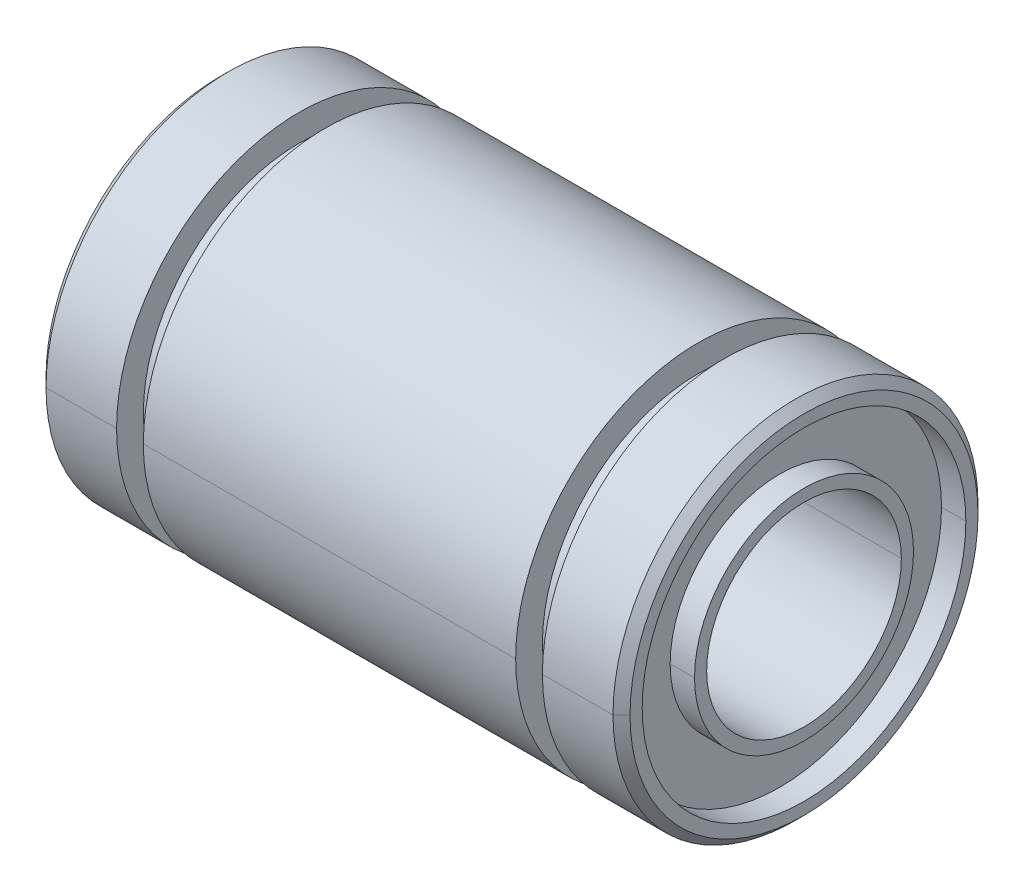
ISO-10303-21;
HEADER;
FILE_DESCRIPTION(('STEP AP214'),'2;1');
FILE_NAME('part.step','',(''),(''),'','','');
FILE_SCHEMA(('AUTOMOTIVE_DESIGN { 1 0 10303 214 1 1 1 1 }'));
ENDSEC;
DATA;
#1=APPLICATION_CONTEXT('core data for automotive mechanical design processes');
#2=APPLICATION_PROTOCOL_DEFINITION('international standard','automotive_design',2000,#1);
#3=PRODUCT_CONTEXT('',#1,'mechanical');
#4=PRODUCT('Part','Part','',(#3));
#5=PRODUCT_RELATED_PRODUCT_CATEGORY('part','',(#4));
#6=PRODUCT_DEFINITION_FORMATION('','',#4);
#7=PRODUCT_DEFINITION_CONTEXT('part definition',#1,'design');
#8=PRODUCT_DEFINITION('design','',#6,#7);
#9=PRODUCT_DEFINITION_SHAPE('','',#8);
#10=(LENGTH_UNIT() NAMED_UNIT(*) SI_UNIT(.MILLI.,.METRE.));
#11=(NAMED_UNIT(*) PLANE_ANGLE_UNIT() SI_UNIT($,.RADIAN.));
#12=(NAMED_UNIT(*) SI_UNIT($,.STERADIAN.) SOLID_ANGLE_UNIT());
#13=UNCERTAINTY_MEASURE_WITH_UNIT(LENGTH_MEASURE(1.E-05),#10,'distance_accuracy_value','');
#14=(GEOMETRIC_REPRESENTATION_CONTEXT(3) GLOBAL_UNCERTAINTY_ASSIGNED_CONTEXT((#13)) GLOBAL_UNIT_ASSIGNED_CONTEXT((#10,
#11,#12)) REPRESENTATION_CONTEXT('',''));
#15=CARTESIAN_POINT('',(0.,0.,0.));
#16=DIRECTION('',(0.,0.,1.));
#17=DIRECTION('',(1.,0.,0.));
#18=AXIS2_PLACEMENT_3D('',#15,#16,#17);
#19=CARTESIAN_POINT('',(12.,0.,0.));
#20=DIRECTION('',(1.,0.,0.));
#21=DIRECTION('',(0.,1.,0.));
#22=AXIS2_PLACEMENT_3D('',#19,#20,#21);
#23=PLANE('',#22);
#24=CARTESIAN_POINT('',(12.,0.,0.));
#25=DIRECTION('',(-1.,0.,0.));
#26=DIRECTION('',(0.,0.,1.));
#27=AXIS2_PLACEMENT_3D('',#24,#25,#26);
#28=CIRCLE('',#27,6.65);
#29=CARTESIAN_POINT('',(12.,0.,6.65));
#30=VERTEX_POINT('',#29);
#31=CARTESIAN_POINT('',(12.,0.,-6.65));
#32=VERTEX_POINT('',#31);
#33=EDGE_CURVE('E10',#30,#32,#28,.T.);
#34=ORIENTED_EDGE('',*,*,#33,.T.);
#35=CARTESIAN_POINT('',(12.,0.,0.));
#36=DIRECTION('',(-1.,0.,0.));
#37=DIRECTION('',(0.,0.,1.));
#38=AXIS2_PLACEMENT_3D('',#35,#36,#37);
#39=CIRCLE('',#38,6.65);
#40=EDGE_CURVE('E1077',#32,#30,#39,.T.);
#41=ORIENTED_EDGE('',*,*,#40,.T.);
#42=EDGE_LOOP('',(#34,#41));
#43=FACE_BOUND('',#42,.T.);
#44=CARTESIAN_POINT('',(12.,0.,0.));
#45=DIRECTION('',(-1.,0.,0.));
#46=DIRECTION('',(0.,0.,1.));
#47=AXIS2_PLACEMENT_3D('',#44,#45,#46);
#48=CIRCLE('',#47,7.15);
#49=CARTESIAN_POINT('',(12.,0.,7.15));
#50=VERTEX_POINT('',#49);
#51=CARTESIAN_POINT('',(12.,0.,-7.15));
#52=VERTEX_POINT('',#51);
#53=EDGE_CURVE('E385',#50,#52,#48,.T.);
#54=ORIENTED_EDGE('',*,*,#53,.F.);
#55=CARTESIAN_POINT('',(12.,0.,0.));
#56=DIRECTION('',(-1.,0.,0.));
#57=DIRECTION('',(0.,0.,1.));
#58=AXIS2_PLACEMENT_3D('',#55,#56,#57);
#59=CIRCLE('',#58,7.15);
#60=EDGE_CURVE('E36',#52,#50,#59,.T.);
#61=ORIENTED_EDGE('',*,*,#60,.F.);
#62=EDGE_LOOP('',(#54,#61));
#63=FACE_BOUND('',#62,.T.);
#64=ADVANCED_FACE('F16',(#43,#63),#23,.T.);
#65=CARTESIAN_POINT('',(-45.6895053247726,0.,0.));
#66=DIRECTION('',(-1.,0.,0.));
#67=DIRECTION('',(0.,0.,1.));
#68=AXIS2_PLACEMENT_3D('',#65,#66,#67);
#69=CYLINDRICAL_SURFACE('',#68,6.65);
#70=DIRECTION('',(-1.,0.,0.));
#71=VECTOR('',#70,1.);
#72=CARTESIAN_POINT('',(-45.6895053247726,0.,-6.65));
#73=LINE('',#72,#71);
#74=CARTESIAN_POINT('',(11.,0.,-6.65));
#75=VERTEX_POINT('',#74);
#76=EDGE_CURVE('E1072',#32,#75,#73,.T.);
#77=ORIENTED_EDGE('',*,*,#76,.F.);
#78=ORIENTED_EDGE('',*,*,#33,.F.);
#79=DIRECTION('',(-1.,0.,0.));
#80=VECTOR('',#79,1.);
#81=CARTESIAN_POINT('',(-45.6895053247726,0.,6.65));
#82=LINE('',#81,#80);
#83=CARTESIAN_POINT('',(11.,0.,6.65));
#84=VERTEX_POINT('',#83);
#85=EDGE_CURVE('E449',#30,#84,#82,.T.);
#86=ORIENTED_EDGE('',*,*,#85,.T.);
#87=CARTESIAN_POINT('',(11.,0.,0.));
#88=DIRECTION('',(-1.,0.,0.));
#89=DIRECTION('',(0.,0.,1.));
#90=AXIS2_PLACEMENT_3D('',#87,#88,#89);
#91=CIRCLE('',#90,6.65);
#92=EDGE_CURVE('E24',#84,#75,#91,.T.);
#93=ORIENTED_EDGE('',*,*,#92,.T.);
#94=EDGE_LOOP('',(#77,#78,#86,#93));
#95=FACE_BOUND('',#94,.T.);
#96=ADVANCED_FACE('F509',(#95),#69,.F.);
#97=CARTESIAN_POINT('',(11.,0.,0.));
#98=DIRECTION('',(1.,0.,0.));
#99=DIRECTION('',(0.,1.,0.));
#100=AXIS2_PLACEMENT_3D('',#97,#98,#99);
#101=PLANE('',#100);
#102=CARTESIAN_POINT('',(11.,0.,0.));
#103=DIRECTION('',(-1.,0.,0.));
#104=DIRECTION('',(0.,0.,1.));
#105=AXIS2_PLACEMENT_3D('',#102,#103,#104);
#106=CIRCLE('',#105,4.5);
#107=CARTESIAN_POINT('',(11.,0.,4.5));
#108=VERTEX_POINT('',#107);
#109=CARTESIAN_POINT('',(11.,0.,-4.5));
#110=VERTEX_POINT('',#109);
#111=EDGE_CURVE('E456',#108,#110,#106,.T.);
#112=ORIENTED_EDGE('',*,*,#111,.T.);
#113=CARTESIAN_POINT('',(11.,0.,0.));
#114=DIRECTION('',(-1.,0.,0.));
#115=DIRECTION('',(0.,0.,1.));
#116=AXIS2_PLACEMENT_3D('',#113,#114,#115);
#117=CIRCLE('',#116,4.5);
#118=EDGE_CURVE('E424',#110,#108,#117,.T.);
#119=ORIENTED_EDGE('',*,*,#118,.T.);
#120=EDGE_LOOP('',(#112,#119));
#121=FACE_BOUND('',#120,.T.);
#122=ORIENTED_EDGE('',*,*,#92,.F.);
#123=CARTESIAN_POINT('',(11.,0.,0.));
#124=DIRECTION('',(-1.,0.,0.));
#125=DIRECTION('',(0.,0.,1.));
#126=AXIS2_PLACEMENT_3D('',#123,#124,#125);
#127=CIRCLE('',#126,6.65);
#128=EDGE_CURVE('E443',#75,#84,#127,.T.);
#129=ORIENTED_EDGE('',*,*,#128,.F.);
#130=EDGE_LOOP('',(#122,#129));
#131=FACE_BOUND('',#130,.T.);
#132=ADVANCED_FACE('F514',(#121,#131),#101,.T.);
#133=CARTESIAN_POINT('',(-45.6895053247726,0.,0.));
#134=DIRECTION('',(-1.,0.,0.));
#135=DIRECTION('',(0.,0.,1.));
#136=AXIS2_PLACEMENT_3D('',#133,#134,#135);
#137=CYLINDRICAL_SURFACE('',#136,4.5);
#138=DIRECTION('',(-1.,0.,0.));
#139=VECTOR('',#138,1.);
#140=CARTESIAN_POINT('',(-45.6895053247726,0.,-4.5));
#141=LINE('',#140,#139);
#142=CARTESIAN_POINT('',(12.,0.,-4.5));
#143=VERTEX_POINT('',#142);
#144=EDGE_CURVE('E448',#143,#110,#141,.T.);
#145=ORIENTED_EDGE('',*,*,#144,.F.);
#146=CARTESIAN_POINT('',(12.,0.,0.));
#147=DIRECTION('',(-1.,0.,0.));
#148=DIRECTION('',(0.,0.,1.));
#149=AXIS2_PLACEMENT_3D('',#146,#147,#148);
#150=CIRCLE('',#149,4.5);
#151=CARTESIAN_POINT('',(12.,0.,4.5));
#152=VERTEX_POINT('',#151);
#153=EDGE_CURVE('E422',#143,#152,#150,.T.);
#154=ORIENTED_EDGE('',*,*,#153,.T.);
#155=DIRECTION('',(-1.,0.,0.));
#156=VECTOR('',#155,1.);
#157=CARTESIAN_POINT('',(-45.6895053247726,0.,4.5));
#158=LINE('',#157,#156);
#159=EDGE_CURVE('E245',#152,#108,#158,.T.);
#160=ORIENTED_EDGE('',*,*,#159,.T.);
#161=ORIENTED_EDGE('',*,*,#118,.F.);
#162=EDGE_LOOP('',(#145,#154,#160,#161));
#163=FACE_BOUND('',#162,.T.);
#164=ADVANCED_FACE('F832',(#163),#137,.T.);
#165=CARTESIAN_POINT('',(12.,0.,0.));
#166=DIRECTION('',(1.,0.,0.));
#167=DIRECTION('',(0.,1.,0.));
#168=AXIS2_PLACEMENT_3D('',#165,#166,#167);
#169=PLANE('',#168);
#170=CARTESIAN_POINT('',(12.,0.,0.));
#171=DIRECTION('',(-1.,0.,0.));
#172=DIRECTION('',(0.,0.,1.));
#173=AXIS2_PLACEMENT_3D('',#170,#171,#172);
#174=CIRCLE('',#173,4.);
#175=CARTESIAN_POINT('',(12.,0.,4.));
#176=VERTEX_POINT('',#175);
#177=CARTESIAN_POINT('',(12.,0.,-4.));
#178=VERTEX_POINT('',#177);
#179=EDGE_CURVE('E227',#176,#178,#174,.T.);
#180=ORIENTED_EDGE('',*,*,#179,.T.);
#181=CARTESIAN_POINT('',(12.,0.,0.));
#182=DIRECTION('',(-1.,0.,0.));
#183=DIRECTION('',(0.,0.,1.));
#184=AXIS2_PLACEMENT_3D('',#181,#182,#183);
#185=CIRCLE('',#184,4.);
#186=EDGE_CURVE('E238',#178,#176,#185,.T.);
#187=ORIENTED_EDGE('',*,*,#186,.T.);
#188=EDGE_LOOP('',(#180,#187));
#189=FACE_BOUND('',#188,.T.);
#190=CARTESIAN_POINT('',(12.,0.,0.));
#191=DIRECTION('',(-1.,0.,0.));
#192=DIRECTION('',(0.,0.,1.));
#193=AXIS2_PLACEMENT_3D('',#190,#191,#192);
#194=CIRCLE('',#193,4.5);
#195=EDGE_CURVE('E445',#152,#143,#194,.T.);
#196=ORIENTED_EDGE('',*,*,#195,.F.);
#197=ORIENTED_EDGE('',*,*,#153,.F.);
#198=EDGE_LOOP('',(#196,#197));
#199=FACE_BOUND('',#198,.T.);
#200=ADVANCED_FACE('F824',(#189,#199),#169,.T.);
#201=CARTESIAN_POINT('',(-45.6895053247726,0.,0.));
#202=DIRECTION('',(-1.,0.,0.));
#203=DIRECTION('',(0.,0.,1.));
#204=AXIS2_PLACEMENT_3D('',#201,#202,#203);
#205=CYLINDRICAL_SURFACE('',#204,4.);
#206=DIRECTION('',(-1.,0.,0.));
#207=VECTOR('',#206,1.);
#208=CARTESIAN_POINT('',(-45.6895053247726,0.,-4.));
#209=LINE('',#208,#207);
#210=CARTESIAN_POINT('',(-12.,0.,-4.));
#211=VERTEX_POINT('',#210);
#212=EDGE_CURVE('E220',#178,#211,#209,.T.);
#213=ORIENTED_EDGE('',*,*,#212,.F.);
#214=ORIENTED_EDGE('',*,*,#179,.F.);
#215=DIRECTION('',(-1.,0.,0.));
#216=VECTOR('',#215,1.);
#217=CARTESIAN_POINT('',(-45.6895053247726,0.,4.));
#218=LINE('',#217,#216);
#219=CARTESIAN_POINT('',(-12.,0.,4.));
#220=VERTEX_POINT('',#219);
#221=EDGE_CURVE('E223',#176,#220,#218,.T.);
#222=ORIENTED_EDGE('',*,*,#221,.T.);
#223=CARTESIAN_POINT('',(-12.,0.,0.));
#224=DIRECTION('',(-1.,0.,0.));
#225=DIRECTION('',(0.,0.,1.));
#226=AXIS2_PLACEMENT_3D('',#223,#224,#225);
#227=CIRCLE('',#226,4.);
#228=EDGE_CURVE('E216',#220,#211,#227,.T.);
#229=ORIENTED_EDGE('',*,*,#228,.T.);
#230=EDGE_LOOP('',(#213,#214,#222,#229));
#231=FACE_BOUND('',#230,.T.);
#232=ADVANCED_FACE('F218',(#231),#205,.F.);
#233=CARTESIAN_POINT('',(-12.,0.,0.));
#234=DIRECTION('',(1.,0.,0.));
#235=DIRECTION('',(0.,1.,0.));
#236=AXIS2_PLACEMENT_3D('',#233,#234,#235);
#237=PLANE('',#236);
#238=ORIENTED_EDGE('',*,*,#228,.F.);
#239=CARTESIAN_POINT('',(-12.,0.,0.));
#240=DIRECTION('',(-1.,0.,0.));
#241=DIRECTION('',(0.,0.,1.));
#242=AXIS2_PLACEMENT_3D('',#239,#240,#241);
#243=CIRCLE('',#242,4.);
#244=EDGE_CURVE('E230',#211,#220,#243,.T.);
#245=ORIENTED_EDGE('',*,*,#244,.F.);
#246=EDGE_LOOP('',(#238,#245));
#247=FACE_BOUND('',#246,.T.);
#248=CARTESIAN_POINT('',(-12.,0.,0.));
#249=DIRECTION('',(-1.,0.,0.));
#250=DIRECTION('',(0.,0.,1.));
#251=AXIS2_PLACEMENT_3D('',#248,#249,#250);
#252=CIRCLE('',#251,4.5);
#253=CARTESIAN_POINT('',(-12.,0.,4.5));
#254=VERTEX_POINT('',#253);
#255=CARTESIAN_POINT('',(-12.,0.,-4.5));
#256=VERTEX_POINT('',#255);
#257=EDGE_CURVE('E260',#254,#256,#252,.T.);
#258=ORIENTED_EDGE('',*,*,#257,.T.);
#259=CARTESIAN_POINT('',(-12.,0.,0.));
#260=DIRECTION('',(-1.,0.,0.));
#261=DIRECTION('',(0.,0.,1.));
#262=AXIS2_PLACEMENT_3D('',#259,#260,#261);
#263=CIRCLE('',#262,4.5);
#264=EDGE_CURVE('E228',#256,#254,#263,.T.);
#265=ORIENTED_EDGE('',*,*,#264,.T.);
#266=EDGE_LOOP('',(#258,#265));
#267=FACE_BOUND('',#266,.T.);
#268=ADVANCED_FACE('F231',(#247,#267),#237,.F.);
#269=CARTESIAN_POINT('',(-45.6895053247726,0.,0.));
#270=DIRECTION('',(-1.,0.,0.));
#271=DIRECTION('',(0.,0.,1.));
#272=AXIS2_PLACEMENT_3D('',#269,#270,#271);
#273=CYLINDRICAL_SURFACE('',#272,4.5);
#274=DIRECTION('',(-1.,0.,0.));
#275=VECTOR('',#274,1.);
#276=CARTESIAN_POINT('',(-45.6895053247726,0.,-4.5));
#277=LINE('',#276,#275);
#278=CARTESIAN_POINT('',(-11.,0.,-4.5));
#279=VERTEX_POINT('',#278);
#280=EDGE_CURVE('E259',#279,#256,#277,.T.);
#281=ORIENTED_EDGE('',*,*,#280,.F.);
#282=CARTESIAN_POINT('',(-11.,0.,0.));
#283=DIRECTION('',(-1.,0.,0.));
#284=DIRECTION('',(0.,0.,1.));
#285=AXIS2_PLACEMENT_3D('',#282,#283,#284);
#286=CIRCLE('',#285,4.5);
#287=CARTESIAN_POINT('',(-11.,0.,4.5));
#288=VERTEX_POINT('',#287);
#289=EDGE_CURVE('E416',#279,#288,#286,.T.);
#290=ORIENTED_EDGE('',*,*,#289,.T.);
#291=DIRECTION('',(-1.,0.,0.));
#292=VECTOR('',#291,1.);
#293=CARTESIAN_POINT('',(-45.6895053247726,0.,4.5));
#294=LINE('',#293,#292);
#295=EDGE_CURVE('E264',#288,#254,#294,.T.);
#296=ORIENTED_EDGE('',*,*,#295,.T.);
#297=ORIENTED_EDGE('',*,*,#264,.F.);
#298=EDGE_LOOP('',(#281,#290,#296,#297));
#299=FACE_BOUND('',#298,.T.);
#300=ADVANCED_FACE('F580',(#299),#273,.T.);
#301=CARTESIAN_POINT('',(-11.,0.,0.));
#302=DIRECTION('',(1.,0.,0.));
#303=DIRECTION('',(0.,1.,0.));
#304=AXIS2_PLACEMENT_3D('',#301,#302,#303);
#305=PLANE('',#304);
#306=CARTESIAN_POINT('',(-11.,0.,0.));
#307=DIRECTION('',(-1.,0.,0.));
#308=DIRECTION('',(0.,0.,1.));
#309=AXIS2_PLACEMENT_3D('',#306,#307,#308);
#310=CIRCLE('',#309,4.5);
#311=EDGE_CURVE('E250',#288,#279,#310,.T.);
#312=ORIENTED_EDGE('',*,*,#311,.F.);
#313=ORIENTED_EDGE('',*,*,#289,.F.);
#314=EDGE_LOOP('',(#312,#313));
#315=FACE_BOUND('',#314,.T.);
#316=CARTESIAN_POINT('',(-11.,0.,0.));
#317=DIRECTION('',(-1.,0.,0.));
#318=DIRECTION('',(0.,0.,1.));
#319=AXIS2_PLACEMENT_3D('',#316,#317,#318);
#320=CIRCLE('',#319,6.65);
#321=CARTESIAN_POINT('',(-11.,0.,6.65));
#322=VERTEX_POINT('',#321);
#323=CARTESIAN_POINT('',(-11.,0.,-6.65));
#324=VERTEX_POINT('',#323);
#325=EDGE_CURVE('E254',#322,#324,#320,.T.);
#326=ORIENTED_EDGE('',*,*,#325,.T.);
#327=CARTESIAN_POINT('',(-11.,0.,0.));
#328=DIRECTION('',(-1.,0.,0.));
#329=DIRECTION('',(0.,0.,1.));
#330=AXIS2_PLACEMENT_3D('',#327,#328,#329);
#331=CIRCLE('',#330,6.65);
#332=EDGE_CURVE('E268',#324,#322,#331,.T.);
#333=ORIENTED_EDGE('',*,*,#332,.T.);
#334=EDGE_LOOP('',(#326,#333));
#335=FACE_BOUND('',#334,.T.);
#336=ADVANCED_FACE('F505',(#315,#335),#305,.F.);
#337=CARTESIAN_POINT('',(-45.6895053247726,0.,0.));
#338=DIRECTION('',(-1.,0.,0.));
#339=DIRECTION('',(0.,0.,1.));
#340=AXIS2_PLACEMENT_3D('',#337,#338,#339);
#341=CYLINDRICAL_SURFACE('',#340,6.65);
#342=DIRECTION('',(-1.,0.,0.));
#343=VECTOR('',#342,1.);
#344=CARTESIAN_POINT('',(-45.6895053247726,0.,-6.65));
#345=LINE('',#344,#343);
#346=CARTESIAN_POINT('',(-12.,0.,-6.65));
#347=VERTEX_POINT('',#346);
#348=EDGE_CURVE('E272',#324,#347,#345,.T.);
#349=ORIENTED_EDGE('',*,*,#348,.F.);
#350=ORIENTED_EDGE('',*,*,#325,.F.);
#351=DIRECTION('',(-1.,0.,0.));
#352=VECTOR('',#351,1.);
#353=CARTESIAN_POINT('',(-45.6895053247726,0.,6.65));
#354=LINE('',#353,#352);
#355=CARTESIAN_POINT('',(-12.,0.,6.65));
#356=VERTEX_POINT('',#355);
#357=EDGE_CURVE('E285',#322,#356,#354,.T.);
#358=ORIENTED_EDGE('',*,*,#357,.T.);
#359=CARTESIAN_POINT('',(-12.,0.,0.));
#360=DIRECTION('',(-1.,0.,0.));
#361=DIRECTION('',(0.,0.,1.));
#362=AXIS2_PLACEMENT_3D('',#359,#360,#361);
#363=CIRCLE('',#362,6.65);
#364=EDGE_CURVE('E251',#356,#347,#363,.T.);
#365=ORIENTED_EDGE('',*,*,#364,.T.);
#366=EDGE_LOOP('',(#349,#350,#358,#365));
#367=FACE_BOUND('',#366,.T.);
#368=ADVANCED_FACE('F496',(#367),#341,.F.);
#369=CARTESIAN_POINT('',(-12.,0.,0.));
#370=DIRECTION('',(1.,0.,0.));
#371=DIRECTION('',(0.,1.,0.));
#372=AXIS2_PLACEMENT_3D('',#369,#370,#371);
#373=PLANE('',#372);
#374=ORIENTED_EDGE('',*,*,#364,.F.);
#375=CARTESIAN_POINT('',(-12.,0.,0.));
#376=DIRECTION('',(-1.,0.,0.));
#377=DIRECTION('',(0.,0.,1.));
#378=AXIS2_PLACEMENT_3D('',#375,#376,#377);
#379=CIRCLE('',#378,6.65);
#380=EDGE_CURVE('E281',#347,#356,#379,.T.);
#381=ORIENTED_EDGE('',*,*,#380,.F.);
#382=EDGE_LOOP('',(#374,#381));
#383=FACE_BOUND('',#382,.T.);
#384=CARTESIAN_POINT('',(-12.,0.,0.));
#385=DIRECTION('',(-1.,0.,0.));
#386=DIRECTION('',(0.,0.,1.));
#387=AXIS2_PLACEMENT_3D('',#384,#385,#386);
#388=CIRCLE('',#387,7.15);
#389=CARTESIAN_POINT('',(-12.,0.,-7.15));
#390=VERTEX_POINT('',#389);
#391=CARTESIAN_POINT('',(-12.,0.,7.15));
#392=VERTEX_POINT('',#391);
#393=EDGE_CURVE('E255',#390,#392,#388,.T.);
#394=ORIENTED_EDGE('',*,*,#393,.T.);
#395=CARTESIAN_POINT('',(-12.,0.,0.));
#396=DIRECTION('',(-1.,0.,0.));
#397=DIRECTION('',(0.,0.,1.));
#398=AXIS2_PLACEMENT_3D('',#395,#396,#397);
#399=CIRCLE('',#398,7.15);
#400=EDGE_CURVE('E289',#392,#390,#399,.T.);
#401=ORIENTED_EDGE('',*,*,#400,.T.);
#402=EDGE_LOOP('',(#394,#401));
#403=FACE_BOUND('',#402,.T.);
#404=ADVANCED_FACE('F494',(#383,#403),#373,.F.);
#405=CARTESIAN_POINT('',(-11.65,0.,0.));
#406=DIRECTION('',(1.,0.,0.));
#407=DIRECTION('',(0.,0.,-1.));
#408=AXIS2_PLACEMENT_3D('',#405,#406,#407);
#409=CONICAL_SURFACE('',#408,7.5,0.785398163397449);
#410=DIRECTION('',(0.707106781186547,0.,0.707106781186548));
#411=VECTOR('',#410,1.);
#412=CARTESIAN_POINT('',(-11.65,0.,7.5));
#413=LINE('',#412,#411);
#414=CARTESIAN_POINT('',(-11.65,0.,7.5));
#415=VERTEX_POINT('',#414);
#416=EDGE_CURVE('E293',#392,#415,#413,.T.);
#417=ORIENTED_EDGE('',*,*,#416,.F.);
#418=ORIENTED_EDGE('',*,*,#393,.F.);
#419=DIRECTION('',(0.707106781186547,0.,-0.707106781186548));
#420=VECTOR('',#419,1.);
#421=CARTESIAN_POINT('',(-11.65,0.,-7.5));
#422=LINE('',#421,#420);
#423=CARTESIAN_POINT('',(-11.65,0.,-7.5));
#424=VERTEX_POINT('',#423);
#425=EDGE_CURVE('E301',#390,#424,#422,.T.);
#426=ORIENTED_EDGE('',*,*,#425,.T.);
#427=CARTESIAN_POINT('',(-11.65,0.,0.));
#428=DIRECTION('',(-1.,0.,0.));
#429=DIRECTION('',(0.,0.,1.));
#430=AXIS2_PLACEMENT_3D('',#427,#428,#429);
#431=CIRCLE('',#430,7.5);
#432=EDGE_CURVE('E276',#424,#415,#431,.T.);
#433=ORIENTED_EDGE('',*,*,#432,.T.);
#434=EDGE_LOOP('',(#417,#418,#426,#433));
#435=FACE_BOUND('',#434,.T.);
#436=ADVANCED_FACE('F488',(#435),#409,.T.);
#437=CARTESIAN_POINT('',(-45.6895053247726,0.,0.));
#438=DIRECTION('',(-1.,0.,0.));
#439=DIRECTION('',(0.,0.,1.));
#440=AXIS2_PLACEMENT_3D('',#437,#438,#439);
#441=CYLINDRICAL_SURFACE('',#440,7.5);
#442=DIRECTION('',(-1.,0.,0.));
#443=VECTOR('',#442,1.);
#444=CARTESIAN_POINT('',(-45.6895053247726,0.,-7.5));
#445=LINE('',#444,#443);
#446=CARTESIAN_POINT('',(-8.75,0.,-7.5));
#447=VERTEX_POINT('',#446);
#448=EDGE_CURVE('E311',#447,#424,#445,.T.);
#449=ORIENTED_EDGE('',*,*,#448,.F.);
#450=CARTESIAN_POINT('',(-8.75,0.,0.));
#451=DIRECTION('',(-1.,0.,0.));
#452=DIRECTION('',(0.,0.,1.));
#453=AXIS2_PLACEMENT_3D('',#450,#451,#452);
#454=CIRCLE('',#453,7.5);
#455=CARTESIAN_POINT('',(-8.75,0.,7.5));
#456=VERTEX_POINT('',#455);
#457=EDGE_CURVE('E273',#447,#456,#454,.T.);
#458=ORIENTED_EDGE('',*,*,#457,.T.);
#459=DIRECTION('',(-1.,0.,0.));
#460=VECTOR('',#459,1.);
#461=CARTESIAN_POINT('',(-45.6895053247726,0.,7.5));
#462=LINE('',#461,#460);
#463=EDGE_CURVE('E315',#456,#415,#462,.T.);
#464=ORIENTED_EDGE('',*,*,#463,.T.);
#465=ORIENTED_EDGE('',*,*,#432,.F.);
#466=EDGE_LOOP('',(#449,#458,#464,#465));
#467=FACE_BOUND('',#466,.T.);
#468=ADVANCED_FACE('F477',(#467),#441,.T.);
#469=CARTESIAN_POINT('',(-8.75,0.,0.));
#470=DIRECTION('',(1.,0.,0.));
#471=DIRECTION('',(0.,1.,0.));
#472=AXIS2_PLACEMENT_3D('',#469,#470,#471);
#473=PLANE('',#472);
#474=CARTESIAN_POINT('',(-8.75,0.,0.));
#475=DIRECTION('',(-1.,0.,0.));
#476=DIRECTION('',(0.,0.,1.));
#477=AXIS2_PLACEMENT_3D('',#474,#475,#476);
#478=CIRCLE('',#477,6.4);
#479=CARTESIAN_POINT('',(-8.75,0.,6.4));
#480=VERTEX_POINT('',#479);
#481=CARTESIAN_POINT('',(-8.75,0.,-6.4));
#482=VERTEX_POINT('',#481);
#483=EDGE_CURVE('E324',#480,#482,#478,.T.);
#484=ORIENTED_EDGE('',*,*,#483,.T.);
#485=CARTESIAN_POINT('',(-8.75,0.,0.));
#486=DIRECTION('',(-1.,0.,0.));
#487=DIRECTION('',(0.,0.,1.));
#488=AXIS2_PLACEMENT_3D('',#485,#486,#487);
#489=CIRCLE('',#488,6.4);
#490=EDGE_CURVE('E277',#482,#480,#489,.T.);
#491=ORIENTED_EDGE('',*,*,#490,.T.);
#492=EDGE_LOOP('',(#484,#491));
#493=FACE_BOUND('',#492,.T.);
#494=CARTESIAN_POINT('',(-8.75,0.,0.));
#495=DIRECTION('',(-1.,0.,0.));
#496=DIRECTION('',(0.,0.,1.));
#497=AXIS2_PLACEMENT_3D('',#494,#495,#496);
#498=CIRCLE('',#497,7.5);
#499=EDGE_CURVE('E305',#456,#447,#498,.T.);
#500=ORIENTED_EDGE('',*,*,#499,.F.);
#501=ORIENTED_EDGE('',*,*,#457,.F.);
#502=EDGE_LOOP('',(#500,#501));
#503=FACE_BOUND('',#502,.T.);
#504=ADVANCED_FACE('F474',(#493,#503),#473,.T.);
#505=CARTESIAN_POINT('',(-45.6895053247726,0.,0.));
#506=DIRECTION('',(-1.,0.,0.));
#507=DIRECTION('',(0.,0.,1.));
#508=AXIS2_PLACEMENT_3D('',#505,#506,#507);
#509=CYLINDRICAL_SURFACE('',#508,6.4);
#510=DIRECTION('',(-1.,0.,0.));
#511=VECTOR('',#510,1.);
#512=CARTESIAN_POINT('',(-45.6895053247726,0.,-6.4));
#513=LINE('',#512,#511);
#514=CARTESIAN_POINT('',(-7.65,0.,-6.4));
#515=VERTEX_POINT('',#514);
#516=EDGE_CURVE('E320',#515,#482,#513,.T.);
#517=ORIENTED_EDGE('',*,*,#516,.F.);
#518=CARTESIAN_POINT('',(-7.65,0.,0.));
#519=DIRECTION('',(-1.,0.,0.));
#520=DIRECTION('',(0.,0.,1.));
#521=AXIS2_PLACEMENT_3D('',#518,#519,#520);
#522=CIRCLE('',#521,6.4);
#523=CARTESIAN_POINT('',(-7.65,0.,6.4));
#524=VERTEX_POINT('',#523);
#525=EDGE_CURVE('E407',#515,#524,#522,.T.);
#526=ORIENTED_EDGE('',*,*,#525,.T.);
#527=DIRECTION('',(-1.,0.,0.));
#528=VECTOR('',#527,1.);
#529=CARTESIAN_POINT('',(-45.6895053247726,0.,6.4));
#530=LINE('',#529,#528);
#531=EDGE_CURVE('E334',#524,#480,#530,.T.);
#532=ORIENTED_EDGE('',*,*,#531,.T.);
#533=ORIENTED_EDGE('',*,*,#490,.F.);
#534=EDGE_LOOP('',(#517,#526,#532,#533));
#535=FACE_BOUND('',#534,.T.);
#536=ADVANCED_FACE('F472',(#535),#509,.T.);
#537=CARTESIAN_POINT('',(-7.65,0.,0.));
#538=DIRECTION('',(-1.,0.,0.));
#539=DIRECTION('',(0.,0.,1.));
#540=AXIS2_PLACEMENT_3D('',#537,#538,#539);
#541=PLANE('',#540);
#542=CARTESIAN_POINT('',(-7.65,0.,0.));
#543=DIRECTION('',(-1.,0.,0.));
#544=DIRECTION('',(0.,0.,1.));
#545=AXIS2_PLACEMENT_3D('',#542,#543,#544);
#546=CIRCLE('',#545,6.4);
#547=EDGE_CURVE('E319',#524,#515,#546,.T.);
#548=ORIENTED_EDGE('',*,*,#547,.F.);
#549=ORIENTED_EDGE('',*,*,#525,.F.);
#550=EDGE_LOOP('',(#548,#549));
#551=FACE_BOUND('',#550,.T.);
#552=CARTESIAN_POINT('',(-7.65,0.,0.));
#553=DIRECTION('',(-1.,0.,0.));
#554=DIRECTION('',(0.,0.,1.));
#555=AXIS2_PLACEMENT_3D('',#552,#553,#554);
#556=CIRCLE('',#555,7.5);
#557=CARTESIAN_POINT('',(-7.65,0.,7.5));
#558=VERTEX_POINT('',#557);
#559=CARTESIAN_POINT('',(-7.65,0.,-7.5));
#560=VERTEX_POINT('',#559);
#561=EDGE_CURVE('E346',#558,#560,#556,.T.);
#562=ORIENTED_EDGE('',*,*,#561,.T.);
#563=CARTESIAN_POINT('',(-7.65,0.,0.));
#564=DIRECTION('',(-1.,0.,0.));
#565=DIRECTION('',(0.,0.,1.));
#566=AXIS2_PLACEMENT_3D('',#563,#564,#565);
#567=CIRCLE('',#566,7.5);
#568=EDGE_CURVE('E362',#560,#558,#567,.T.);
#569=ORIENTED_EDGE('',*,*,#568,.T.);
#570=EDGE_LOOP('',(#562,#569));
#571=FACE_BOUND('',#570,.T.);
#572=ADVANCED_FACE('F469',(#551,#571),#541,.T.);
#573=CARTESIAN_POINT('',(-45.6895053247726,0.,0.));
#574=DIRECTION('',(-1.,0.,0.));
#575=DIRECTION('',(0.,0.,1.));
#576=AXIS2_PLACEMENT_3D('',#573,#574,#575);
#577=CYLINDRICAL_SURFACE('',#576,7.5);
#578=DIRECTION('',(-1.,0.,0.));
#579=VECTOR('',#578,1.);
#580=CARTESIAN_POINT('',(-45.6895053247726,0.,-7.5));
#581=LINE('',#580,#579);
#582=CARTESIAN_POINT('',(7.65,0.,-7.5));
#583=VERTEX_POINT('',#582);
#584=EDGE_CURVE('E342',#583,#560,#581,.T.);
#585=ORIENTED_EDGE('',*,*,#584,.F.);
#586=CARTESIAN_POINT('',(7.65,0.,0.));
#587=DIRECTION('',(-1.,0.,0.));
#588=DIRECTION('',(0.,0.,1.));
#589=AXIS2_PLACEMENT_3D('',#586,#587,#588);
#590=CIRCLE('',#589,7.5);
#591=CARTESIAN_POINT('',(7.65,0.,7.5));
#592=VERTEX_POINT('',#591);
#593=EDGE_CURVE('E359',#583,#592,#590,.T.);
#594=ORIENTED_EDGE('',*,*,#593,.T.);
#595=DIRECTION('',(-1.,0.,0.));
#596=VECTOR('',#595,1.);
#597=CARTESIAN_POINT('',(-45.6895053247726,0.,7.5));
#598=LINE('',#597,#596);
#599=EDGE_CURVE('E350',#592,#558,#598,.T.);
#600=ORIENTED_EDGE('',*,*,#599,.T.);
#601=ORIENTED_EDGE('',*,*,#568,.F.);
#602=EDGE_LOOP('',(#585,#594,#600,#601));
#603=FACE_BOUND('',#602,.T.);
#604=ADVANCED_FACE('F561',(#603),#577,.T.);
#605=CARTESIAN_POINT('',(7.65,0.,0.));
#606=DIRECTION('',(-1.,0.,0.));
#607=DIRECTION('',(0.,0.,1.));
#608=AXIS2_PLACEMENT_3D('',#605,#606,#607);
#609=PLANE('',#608);
#610=CARTESIAN_POINT('',(7.65,0.,0.));
#611=DIRECTION('',(-1.,0.,0.));
#612=DIRECTION('',(0.,0.,1.));
#613=AXIS2_PLACEMENT_3D('',#610,#611,#612);
#614=CIRCLE('',#613,6.4);
#615=CARTESIAN_POINT('',(7.65,0.,6.4));
#616=VERTEX_POINT('',#615);
#617=CARTESIAN_POINT('',(7.65,0.,-6.4));
#618=VERTEX_POINT('',#617);
#619=EDGE_CURVE('E367',#616,#618,#614,.T.);
#620=ORIENTED_EDGE('',*,*,#619,.T.);
#621=CARTESIAN_POINT('',(7.65,0.,0.));
#622=DIRECTION('',(-1.,0.,0.));
#623=DIRECTION('',(0.,0.,1.));
#624=AXIS2_PLACEMENT_3D('',#621,#622,#623);
#625=CIRCLE('',#624,6.4);
#626=EDGE_CURVE('E363',#618,#616,#625,.T.);
#627=ORIENTED_EDGE('',*,*,#626,.T.);
#628=EDGE_LOOP('',(#620,#627));
#629=FACE_BOUND('',#628,.T.);
#630=CARTESIAN_POINT('',(7.65,0.,0.));
#631=DIRECTION('',(-1.,0.,0.));
#632=DIRECTION('',(0.,0.,1.));
#633=AXIS2_PLACEMENT_3D('',#630,#631,#632);
#634=CIRCLE('',#633,7.5);
#635=EDGE_CURVE('E338',#592,#583,#634,.T.);
#636=ORIENTED_EDGE('',*,*,#635,.F.);
#637=ORIENTED_EDGE('',*,*,#593,.F.);
#638=EDGE_LOOP('',(#636,#637));
#639=FACE_BOUND('',#638,.T.);
#640=ADVANCED_FACE('F540',(#629,#639),#609,.F.);
#641=CARTESIAN_POINT('',(-45.6895053247726,0.,0.));
#642=DIRECTION('',(-1.,0.,0.));
#643=DIRECTION('',(0.,0.,1.));
#644=AXIS2_PLACEMENT_3D('',#641,#642,#643);
#645=CYLINDRICAL_SURFACE('',#644,6.4);
#646=DIRECTION('',(-1.,0.,0.));
#647=VECTOR('',#646,1.);
#648=CARTESIAN_POINT('',(-45.6895053247726,0.,-6.4));
#649=LINE('',#648,#647);
#650=CARTESIAN_POINT('',(8.75,0.,-6.4));
#651=VERTEX_POINT('',#650);
#652=EDGE_CURVE('E358',#651,#618,#649,.T.);
#653=ORIENTED_EDGE('',*,*,#652,.F.);
#654=CARTESIAN_POINT('',(8.75,0.,0.));
#655=DIRECTION('',(-1.,0.,0.));
#656=DIRECTION('',(0.,0.,1.));
#657=AXIS2_PLACEMENT_3D('',#654,#655,#656);
#658=CIRCLE('',#657,6.4);
#659=CARTESIAN_POINT('',(8.75,0.,6.4));
#660=VERTEX_POINT('',#659);
#661=EDGE_CURVE('E404',#651,#660,#658,.T.);
#662=ORIENTED_EDGE('',*,*,#661,.T.);
#663=DIRECTION('',(-1.,0.,0.));
#664=VECTOR('',#663,1.);
#665=CARTESIAN_POINT('',(-45.6895053247726,0.,6.4));
#666=LINE('',#665,#664);
#667=EDGE_CURVE('E371',#660,#616,#666,.T.);
#668=ORIENTED_EDGE('',*,*,#667,.T.);
#669=ORIENTED_EDGE('',*,*,#626,.F.);
#670=EDGE_LOOP('',(#653,#662,#668,#669));
#671=FACE_BOUND('',#670,.T.);
#672=ADVANCED_FACE('F532',(#671),#645,.T.);
#673=CARTESIAN_POINT('',(8.75,0.,0.));
#674=DIRECTION('',(1.,0.,0.));
#675=DIRECTION('',(0.,1.,0.));
#676=AXIS2_PLACEMENT_3D('',#673,#674,#675);
#677=PLANE('',#676);
#678=CARTESIAN_POINT('',(8.75,0.,0.));
#679=DIRECTION('',(-1.,0.,0.));
#680=DIRECTION('',(0.,0.,1.));
#681=AXIS2_PLACEMENT_3D('',#678,#679,#680);
#682=CIRCLE('',#681,6.4);
#683=EDGE_CURVE('E354',#660,#651,#682,.T.);
#684=ORIENTED_EDGE('',*,*,#683,.F.);
#685=ORIENTED_EDGE('',*,*,#661,.F.);
#686=EDGE_LOOP('',(#684,#685));
#687=FACE_BOUND('',#686,.T.);
#688=CARTESIAN_POINT('',(8.75,0.,0.));
#689=DIRECTION('',(-1.,0.,0.));
#690=DIRECTION('',(0.,0.,1.));
#691=AXIS2_PLACEMENT_3D('',#688,#689,#690);
#692=CIRCLE('',#691,7.5);
#693=CARTESIAN_POINT('',(8.75,0.,7.5));
#694=VERTEX_POINT('',#693);
#695=CARTESIAN_POINT('',(8.75,0.,-7.5));
#696=VERTEX_POINT('',#695);
#697=EDGE_CURVE('E329',#694,#696,#692,.T.);
#698=ORIENTED_EDGE('',*,*,#697,.T.);
#699=CARTESIAN_POINT('',(8.75,0.,0.));
#700=DIRECTION('',(-1.,0.,0.));
#701=DIRECTION('',(0.,0.,1.));
#702=AXIS2_PLACEMENT_3D('',#699,#700,#701);
#703=CIRCLE('',#702,7.5);
#704=EDGE_CURVE('E401',#696,#694,#703,.T.);
#705=ORIENTED_EDGE('',*,*,#704,.T.);
#706=EDGE_LOOP('',(#698,#705));
#707=FACE_BOUND('',#706,.T.);
#708=ADVANCED_FACE('F530',(#687,#707),#677,.F.);
#709=CARTESIAN_POINT('',(-45.6895053247726,0.,0.));
#710=DIRECTION('',(-1.,0.,0.));
#711=DIRECTION('',(0.,0.,1.));
#712=AXIS2_PLACEMENT_3D('',#709,#710,#711);
#713=CYLINDRICAL_SURFACE('',#712,7.5);
#714=DIRECTION('',(-1.,0.,0.));
#715=VECTOR('',#714,1.);
#716=CARTESIAN_POINT('',(-45.6895053247726,0.,-7.5));
#717=LINE('',#716,#715);
#718=CARTESIAN_POINT('',(11.65,0.,-7.5));
#719=VERTEX_POINT('',#718);
#720=EDGE_CURVE('E325',#719,#696,#717,.T.);
#721=ORIENTED_EDGE('',*,*,#720,.F.);
#722=CARTESIAN_POINT('',(11.65,0.,0.));
#723=DIRECTION('',(-1.,0.,0.));
#724=DIRECTION('',(0.,0.,1.));
#725=AXIS2_PLACEMENT_3D('',#722,#723,#724);
#726=CIRCLE('',#725,7.5);
#727=CARTESIAN_POINT('',(11.65,0.,7.5));
#728=VERTEX_POINT('',#727);
#729=EDGE_CURVE('E398',#719,#728,#726,.T.);
#730=ORIENTED_EDGE('',*,*,#729,.T.);
#731=DIRECTION('',(-1.,0.,0.));
#732=VECTOR('',#731,1.);
#733=CARTESIAN_POINT('',(-45.6895053247726,0.,7.5));
#734=LINE('',#733,#732);
#735=EDGE_CURVE('E381',#728,#694,#734,.T.);
#736=ORIENTED_EDGE('',*,*,#735,.T.);
#737=ORIENTED_EDGE('',*,*,#704,.F.);
#738=EDGE_LOOP('',(#721,#730,#736,#737));
#739=FACE_BOUND('',#738,.T.);
#740=ADVANCED_FACE('F528',(#739),#713,.T.);
#741=CARTESIAN_POINT('',(11.65,0.,0.));
#742=DIRECTION('',(-1.,0.,0.));
#743=DIRECTION('',(0.,0.,1.));
#744=AXIS2_PLACEMENT_3D('',#741,#742,#743);
#745=CONICAL_SURFACE('',#744,7.5,0.785398163397449);
#746=DIRECTION('',(-0.707106781186547,0.,-0.707106781186548));
#747=VECTOR('',#746,1.);
#748=CARTESIAN_POINT('',(11.65,0.,-7.5));
#749=LINE('',#748,#747);
#750=EDGE_CURVE('E389',#52,#719,#749,.T.);
#751=ORIENTED_EDGE('',*,*,#750,.F.);
#752=ORIENTED_EDGE('',*,*,#60,.T.);
#753=DIRECTION('',(-0.707106781186547,0.,0.707106781186548));
#754=VECTOR('',#753,1.);
#755=CARTESIAN_POINT('',(11.65,0.,7.5));
#756=LINE('',#755,#754);
#757=EDGE_CURVE('E393',#50,#728,#756,.T.);
#758=ORIENTED_EDGE('',*,*,#757,.T.);
#759=ORIENTED_EDGE('',*,*,#729,.F.);
#760=EDGE_LOOP('',(#751,#752,#758,#759));
#761=FACE_BOUND('',#760,.T.);
#762=ADVANCED_FACE('F523',(#761),#745,.T.);
#763=CARTESIAN_POINT('',(11.65,0.,0.));
#764=DIRECTION('',(-1.,0.,0.));
#765=DIRECTION('',(0.,0.,1.));
#766=AXIS2_PLACEMENT_3D('',#763,#764,#765);
#767=CONICAL_SURFACE('',#766,7.5,0.785398163397449);
#768=ORIENTED_EDGE('',*,*,#53,.T.);
#769=ORIENTED_EDGE('',*,*,#750,.T.);
#770=CARTESIAN_POINT('',(11.65,0.,0.));
#771=DIRECTION('',(-1.,0.,0.));
#772=DIRECTION('',(0.,0.,1.));
#773=AXIS2_PLACEMENT_3D('',#770,#771,#772);
#774=CIRCLE('',#773,7.5);
#775=EDGE_CURVE('E330',#728,#719,#774,.T.);
#776=ORIENTED_EDGE('',*,*,#775,.F.);
#777=ORIENTED_EDGE('',*,*,#757,.F.);
#778=EDGE_LOOP('',(#768,#769,#776,#777));
#779=FACE_BOUND('',#778,.T.);
#780=ADVANCED_FACE('F519',(#779),#767,.T.);
#781=CARTESIAN_POINT('',(-45.6895053247726,0.,0.));
#782=DIRECTION('',(-1.,0.,0.));
#783=DIRECTION('',(0.,0.,1.));
#784=AXIS2_PLACEMENT_3D('',#781,#782,#783);
#785=CYLINDRICAL_SURFACE('',#784,7.5);
#786=ORIENTED_EDGE('',*,*,#775,.T.);
#787=ORIENTED_EDGE('',*,*,#720,.T.);
#788=ORIENTED_EDGE('',*,*,#697,.F.);
#789=ORIENTED_EDGE('',*,*,#735,.F.);
#790=EDGE_LOOP('',(#786,#787,#788,#789));
#791=FACE_BOUND('',#790,.T.);
#792=ADVANCED_FACE('F526',(#791),#785,.T.);
#793=CARTESIAN_POINT('',(-45.6895053247726,0.,0.));
#794=DIRECTION('',(-1.,0.,0.));
#795=DIRECTION('',(0.,0.,1.));
#796=AXIS2_PLACEMENT_3D('',#793,#794,#795);
#797=CYLINDRICAL_SURFACE('',#796,6.4);
#798=ORIENTED_EDGE('',*,*,#683,.T.);
#799=ORIENTED_EDGE('',*,*,#652,.T.);
#800=ORIENTED_EDGE('',*,*,#619,.F.);
#801=ORIENTED_EDGE('',*,*,#667,.F.);
#802=EDGE_LOOP('',(#798,#799,#800,#801));
#803=FACE_BOUND('',#802,.T.);
#804=ADVANCED_FACE('F573',(#803),#797,.T.);
#805=CARTESIAN_POINT('',(-45.6895053247726,0.,0.));
#806=DIRECTION('',(-1.,0.,0.));
#807=DIRECTION('',(0.,0.,1.));
#808=AXIS2_PLACEMENT_3D('',#805,#806,#807);
#809=CYLINDRICAL_SURFACE('',#808,7.5);
#810=ORIENTED_EDGE('',*,*,#635,.T.);
#811=ORIENTED_EDGE('',*,*,#584,.T.);
#812=ORIENTED_EDGE('',*,*,#561,.F.);
#813=ORIENTED_EDGE('',*,*,#599,.F.);
#814=EDGE_LOOP('',(#810,#811,#812,#813));
#815=FACE_BOUND('',#814,.T.);
#816=ADVANCED_FACE('F570',(#815),#809,.T.);
#817=CARTESIAN_POINT('',(-45.6895053247726,0.,0.));
#818=DIRECTION('',(-1.,0.,0.));
#819=DIRECTION('',(0.,0.,1.));
#820=AXIS2_PLACEMENT_3D('',#817,#818,#819);
#821=CYLINDRICAL_SURFACE('',#820,6.4);
#822=ORIENTED_EDGE('',*,*,#547,.T.);
#823=ORIENTED_EDGE('',*,*,#516,.T.);
#824=ORIENTED_EDGE('',*,*,#483,.F.);
#825=ORIENTED_EDGE('',*,*,#531,.F.);
#826=EDGE_LOOP('',(#822,#823,#824,#825));
#827=FACE_BOUND('',#826,.T.);
#828=ADVANCED_FACE('F465',(#827),#821,.T.);
#829=CARTESIAN_POINT('',(-45.6895053247726,0.,0.));
#830=DIRECTION('',(-1.,0.,0.));
#831=DIRECTION('',(0.,0.,1.));
#832=AXIS2_PLACEMENT_3D('',#829,#830,#831);
#833=CYLINDRICAL_SURFACE('',#832,7.5);
#834=ORIENTED_EDGE('',*,*,#499,.T.);
#835=ORIENTED_EDGE('',*,*,#448,.T.);
#836=CARTESIAN_POINT('',(-11.65,0.,0.));
#837=DIRECTION('',(-1.,0.,0.));
#838=DIRECTION('',(0.,0.,1.));
#839=AXIS2_PLACEMENT_3D('',#836,#837,#838);
#840=CIRCLE('',#839,7.5);
#841=EDGE_CURVE('E297',#415,#424,#840,.T.);
#842=ORIENTED_EDGE('',*,*,#841,.F.);
#843=ORIENTED_EDGE('',*,*,#463,.F.);
#844=EDGE_LOOP('',(#834,#835,#842,#843));
#845=FACE_BOUND('',#844,.T.);
#846=ADVANCED_FACE('F483',(#845),#833,.T.);
#847=CARTESIAN_POINT('',(-11.65,0.,0.));
#848=DIRECTION('',(1.,0.,0.));
#849=DIRECTION('',(0.,0.,-1.));
#850=AXIS2_PLACEMENT_3D('',#847,#848,#849);
#851=CONICAL_SURFACE('',#850,7.5,0.785398163397449);
#852=ORIENTED_EDGE('',*,*,#400,.F.);
#853=ORIENTED_EDGE('',*,*,#416,.T.);
#854=ORIENTED_EDGE('',*,*,#841,.T.);
#855=ORIENTED_EDGE('',*,*,#425,.F.);
#856=EDGE_LOOP('',(#852,#853,#854,#855));
#857=FACE_BOUND('',#856,.T.);
#858=ADVANCED_FACE('F492',(#857),#851,.T.);
#859=CARTESIAN_POINT('',(-45.6895053247726,0.,0.));
#860=DIRECTION('',(-1.,0.,0.));
#861=DIRECTION('',(0.,0.,1.));
#862=AXIS2_PLACEMENT_3D('',#859,#860,#861);
#863=CYLINDRICAL_SURFACE('',#862,6.65);
#864=ORIENTED_EDGE('',*,*,#332,.F.);
#865=ORIENTED_EDGE('',*,*,#348,.T.);
#866=ORIENTED_EDGE('',*,*,#380,.T.);
#867=ORIENTED_EDGE('',*,*,#357,.F.);
#868=EDGE_LOOP('',(#864,#865,#866,#867));
#869=FACE_BOUND('',#868,.T.);
#870=ADVANCED_FACE('F552',(#869),#863,.F.);
#871=CARTESIAN_POINT('',(-45.6895053247726,0.,0.));
#872=DIRECTION('',(-1.,0.,0.));
#873=DIRECTION('',(0.,0.,1.));
#874=AXIS2_PLACEMENT_3D('',#871,#872,#873);
#875=CYLINDRICAL_SURFACE('',#874,4.5);
#876=ORIENTED_EDGE('',*,*,#311,.T.);
#877=ORIENTED_EDGE('',*,*,#280,.T.);
#878=ORIENTED_EDGE('',*,*,#257,.F.);
#879=ORIENTED_EDGE('',*,*,#295,.F.);
#880=EDGE_LOOP('',(#876,#877,#878,#879));
#881=FACE_BOUND('',#880,.T.);
#882=ADVANCED_FACE('F555',(#881),#875,.T.);
#883=CARTESIAN_POINT('',(-45.6895053247726,0.,0.));
#884=DIRECTION('',(-1.,0.,0.));
#885=DIRECTION('',(0.,0.,1.));
#886=AXIS2_PLACEMENT_3D('',#883,#884,#885);
#887=CYLINDRICAL_SURFACE('',#886,4.);
#888=ORIENTED_EDGE('',*,*,#186,.F.);
#889=ORIENTED_EDGE('',*,*,#212,.T.);
#890=ORIENTED_EDGE('',*,*,#244,.T.);
#891=ORIENTED_EDGE('',*,*,#221,.F.);
#892=EDGE_LOOP('',(#888,#889,#890,#891));
#893=FACE_BOUND('',#892,.T.);
#894=ADVANCED_FACE('F236',(#893),#887,.F.);
#895=CARTESIAN_POINT('',(-45.6895053247726,0.,0.));
#896=DIRECTION('',(-1.,0.,0.));
#897=DIRECTION('',(0.,0.,1.));
#898=AXIS2_PLACEMENT_3D('',#895,#896,#897);
#899=CYLINDRICAL_SURFACE('',#898,4.5);
#900=ORIENTED_EDGE('',*,*,#195,.T.);
#901=ORIENTED_EDGE('',*,*,#144,.T.);
#902=ORIENTED_EDGE('',*,*,#111,.F.);
#903=ORIENTED_EDGE('',*,*,#159,.F.);
#904=EDGE_LOOP('',(#900,#901,#902,#903));
#905=FACE_BOUND('',#904,.T.);
#906=ADVANCED_FACE('F548',(#905),#899,.T.);
#907=CARTESIAN_POINT('',(-45.6895053247726,0.,0.));
#908=DIRECTION('',(-1.,0.,0.));
#909=DIRECTION('',(0.,0.,1.));
#910=AXIS2_PLACEMENT_3D('',#907,#908,#909);
#911=CYLINDRICAL_SURFACE('',#910,6.65);
#912=ORIENTED_EDGE('',*,*,#40,.F.);
#913=ORIENTED_EDGE('',*,*,#76,.T.);
#914=ORIENTED_EDGE('',*,*,#128,.T.);
#915=ORIENTED_EDGE('',*,*,#85,.F.);
#916=EDGE_LOOP('',(#912,#913,#914,#915));
#917=FACE_BOUND('',#916,.T.);
#918=ADVANCED_FACE('F546',(#917),#911,.F.);
#919=CLOSED_SHELL('',(#64,#96,#132,#164,#200,#232,#268,#300,#336,#368,#404,#436,#468,#504,#536,
#572,#604,#640,#672,#708,#740,#762,#780,#792,#804,#816,#828,#846,#858,#870,#882,#894,#906,#918));
#920=MANIFOLD_SOLID_BREP('B1',#919);
#921=ADVANCED_BREP_SHAPE_REPRESENTATION('',(#18,#920),#14);
#922=SHAPE_DEFINITION_REPRESENTATION(#9,#921);
ENDSEC;
END-ISO-10303-21;
